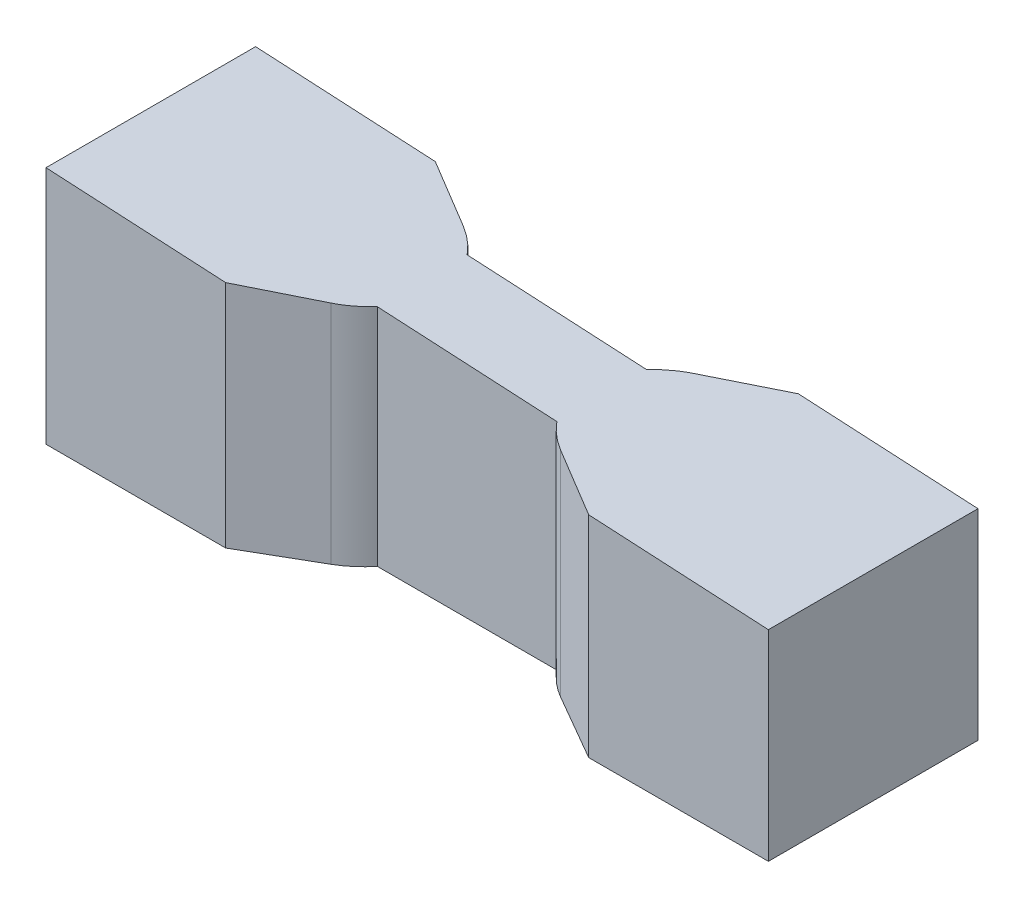
ISO-10303-21;
HEADER;
FILE_DESCRIPTION(('STEP AP214'),'2;1');
FILE_NAME('part.step','',(''),(''),'','','');
FILE_SCHEMA(('AUTOMOTIVE_DESIGN { 1 0 10303 214 1 1 1 1 }'));
ENDSEC;
DATA;
#1=APPLICATION_CONTEXT('core data for automotive mechanical design processes');
#2=APPLICATION_PROTOCOL_DEFINITION('international standard','automotive_design',2000,#1);
#3=PRODUCT_CONTEXT('',#1,'mechanical');
#4=PRODUCT('Part','Part','',(#3));
#5=PRODUCT_RELATED_PRODUCT_CATEGORY('part','',(#4));
#6=PRODUCT_DEFINITION_FORMATION('','',#4);
#7=PRODUCT_DEFINITION_CONTEXT('part definition',#1,'design');
#8=PRODUCT_DEFINITION('design','',#6,#7);
#9=PRODUCT_DEFINITION_SHAPE('','',#8);
#10=(LENGTH_UNIT() NAMED_UNIT(*) SI_UNIT(.MILLI.,.METRE.));
#11=(NAMED_UNIT(*) PLANE_ANGLE_UNIT() SI_UNIT($,.RADIAN.));
#12=(NAMED_UNIT(*) SI_UNIT($,.STERADIAN.) SOLID_ANGLE_UNIT());
#13=UNCERTAINTY_MEASURE_WITH_UNIT(LENGTH_MEASURE(1.E-05),#10,'distance_accuracy_value','');
#14=(GEOMETRIC_REPRESENTATION_CONTEXT(3) GLOBAL_UNCERTAINTY_ASSIGNED_CONTEXT((#13)) GLOBAL_UNIT_ASSIGNED_CONTEXT((#10,
#11,#12)) REPRESENTATION_CONTEXT('',''));
#15=CARTESIAN_POINT('',(0.,0.,0.));
#16=DIRECTION('',(0.,0.,1.));
#17=DIRECTION('',(1.,0.,0.));
#18=AXIS2_PLACEMENT_3D('',#15,#16,#17);
#19=CARTESIAN_POINT('',(-5.33441972255008,20.8867799866972,0.384272952353028));
#20=DIRECTION('',(0.,-1.,0.));
#21=DIRECTION('',(0.,0.,-1.));
#22=AXIS2_PLACEMENT_3D('',#19,#20,#21);
#23=CYLINDRICAL_SURFACE('',#22,3.);
#24=DIRECTION('',(0.,-1.,0.));
#25=VECTOR('',#24,1.);
#26=CARTESIAN_POINT('',(-3.83441972255009,8.,-2.21380325900029));
#27=LINE('',#26,#25);
#28=CARTESIAN_POINT('',(-3.83441972255009,7.5566270996423,-2.21380325900029));
#29=VERTEX_POINT('',#28);
#30=CARTESIAN_POINT('',(-3.83441972255009,0.,-2.21380325900029));
#31=VERTEX_POINT('',#30);
#32=EDGE_CURVE('E180',#29,#31,#27,.T.);
#33=ORIENTED_EDGE('',*,*,#32,.F.);
#34=CARTESIAN_POINT('',(-5.33441972255008,7.6374582740807,0.384272952353028));
#35=DIRECTION('',(-0.0538093788841997,-0.99855122589885,0.));
#36=DIRECTION('',(0.99855122589885,-0.0538093788841997,0.));
#37=AXIS2_PLACEMENT_3D('',#34,#35,#36);
#38=ELLIPSE('',#37,3.00435262827857,3.);
#39=CARTESIAN_POINT('',(-3.,7.51166234887679,-1.5));
#40=VERTEX_POINT('',#39);
#41=EDGE_CURVE('E453',#29,#40,#38,.T.);
#42=ORIENTED_EDGE('',*,*,#41,.T.);
#43=DIRECTION('',(0.,-1.,0.));
#44=VECTOR('',#43,1.);
#45=CARTESIAN_POINT('',(-3.,20.8867799866972,-1.5));
#46=LINE('',#45,#44);
#47=CARTESIAN_POINT('',(-3.,0.,-1.5));
#48=VERTEX_POINT('',#47);
#49=EDGE_CURVE('E193',#40,#48,#46,.T.);
#50=ORIENTED_EDGE('',*,*,#49,.T.);
#51=CARTESIAN_POINT('',(-5.33441972255008,0.,0.384272952353028));
#52=DIRECTION('',(0.,1.,0.));
#53=DIRECTION('',(0.,0.,1.));
#54=AXIS2_PLACEMENT_3D('',#51,#52,#53);
#55=CIRCLE('',#54,3.);
#56=EDGE_CURVE('E182',#48,#31,#55,.T.);
#57=ORIENTED_EDGE('',*,*,#56,.T.);
#58=EDGE_LOOP('',(#33,#42,#50,#57));
#59=FACE_BOUND('',#58,.T.);
#60=ADVANCED_FACE('F36',(#59),#23,.T.);
#61=CARTESIAN_POINT('',(6.06217782649111,8.,-3.5));
#62=DIRECTION('',(0.,0.,1.));
#63=DIRECTION('',(1.,0.,0.));
#64=AXIS2_PLACEMENT_3D('',#61,#62,#63);
#65=PLANE('',#64);
#66=DIRECTION('',(0.,-1.,0.));
#67=VECTOR('',#66,1.);
#68=CARTESIAN_POINT('',(6.06217782649111,8.,-3.5));
#69=LINE('',#68,#67);
#70=CARTESIAN_POINT('',(6.06217782649111,7.02332469775357,-3.5));
#71=VERTEX_POINT('',#70);
#72=CARTESIAN_POINT('',(6.06217782649111,0.,-3.5));
#73=VERTEX_POINT('',#72);
#74=EDGE_CURVE('E44',#71,#73,#69,.T.);
#75=ORIENTED_EDGE('',*,*,#74,.F.);
#76=DIRECTION('',(0.99855122589885,-0.0538093788841997,0.));
#77=VECTOR('',#76,1.);
#78=CARTESIAN_POINT('',(12.0621778264911,6.7,-3.5));
#79=LINE('',#78,#77);
#80=CARTESIAN_POINT('',(12.0621778264911,6.7,-3.5));
#81=VERTEX_POINT('',#80);
#82=EDGE_CURVE('E166',#71,#81,#79,.T.);
#83=ORIENTED_EDGE('',*,*,#82,.T.);
#84=DIRECTION('',(0.,-1.,0.));
#85=VECTOR('',#84,1.);
#86=CARTESIAN_POINT('',(12.0621778264911,8.,-3.5));
#87=LINE('',#86,#85);
#88=CARTESIAN_POINT('',(12.0621778264911,0.,-3.5));
#89=VERTEX_POINT('',#88);
#90=EDGE_CURVE('E218',#81,#89,#87,.T.);
#91=ORIENTED_EDGE('',*,*,#90,.T.);
#92=DIRECTION('',(-1.,0.,0.));
#93=VECTOR('',#92,1.);
#94=CARTESIAN_POINT('',(6.06217782649111,0.,-3.5));
#95=LINE('',#94,#93);
#96=EDGE_CURVE('E197',#89,#73,#95,.T.);
#97=ORIENTED_EDGE('',*,*,#96,.T.);
#98=EDGE_LOOP('',(#75,#83,#91,#97));
#99=FACE_BOUND('',#98,.T.);
#100=ADVANCED_FACE('F38',(#99),#65,.F.);
#101=CARTESIAN_POINT('',(3.83441972255009,8.,-2.21380325900029));
#102=DIRECTION('',(0.499999999999998,0.,0.86602540378444));
#103=DIRECTION('',(0.86602540378444,0.,-0.499999999999998));
#104=AXIS2_PLACEMENT_3D('',#101,#102,#103);
#105=PLANE('',#104);
#106=DIRECTION('',(0.,-1.,0.));
#107=VECTOR('',#106,1.);
#108=CARTESIAN_POINT('',(3.83441972255009,8.,-2.21380325900029));
#109=LINE('',#108,#107);
#110=CARTESIAN_POINT('',(3.83441972255009,7.1433729003577,-2.21380325900029));
#111=VERTEX_POINT('',#110);
#112=CARTESIAN_POINT('',(3.83441972255009,0.,-2.21380325900029));
#113=VERTEX_POINT('',#112);
#114=EDGE_CURVE('E230',#111,#113,#109,.T.);
#115=ORIENTED_EDGE('',*,*,#114,.F.);
#116=DIRECTION('',(0.865083886101273,-0.0466171643341957,-0.499456414512175));
#117=VECTOR('',#116,1.);
#118=CARTESIAN_POINT('',(3.79987387245253,7.1452344881146,-2.19385820314708));
#119=LINE('',#118,#117);
#120=EDGE_CURVE('E238',#111,#71,#119,.T.);
#121=ORIENTED_EDGE('',*,*,#120,.T.);
#122=ORIENTED_EDGE('',*,*,#74,.T.);
#123=DIRECTION('',(-0.86602540378444,0.,0.499999999999998));
#124=VECTOR('',#123,1.);
#125=CARTESIAN_POINT('',(3.83441972255009,0.,-2.21380325900029));
#126=LINE('',#125,#124);
#127=EDGE_CURVE('E200',#73,#113,#126,.T.);
#128=ORIENTED_EDGE('',*,*,#127,.T.);
#129=EDGE_LOOP('',(#115,#121,#122,#128));
#130=FACE_BOUND('',#129,.T.);
#131=ADVANCED_FACE('F236',(#130),#105,.F.);
#132=CARTESIAN_POINT('',(5.33441972255008,8.,0.384272952353028));
#133=DIRECTION('',(0.,-1.,0.));
#134=DIRECTION('',(0.,0.,-1.));
#135=AXIS2_PLACEMENT_3D('',#132,#133,#134);
#136=CYLINDRICAL_SURFACE('',#135,3.);
#137=DIRECTION('',(0.,-1.,0.));
#138=VECTOR('',#137,1.);
#139=CARTESIAN_POINT('',(3.,8.,-1.5));
#140=LINE('',#139,#138);
#141=CARTESIAN_POINT('',(3.,7.18833765112322,-1.5));
#142=VERTEX_POINT('',#141);
#143=CARTESIAN_POINT('',(3.,0.,-1.5));
#144=VERTEX_POINT('',#143);
#145=EDGE_CURVE('E228',#142,#144,#140,.T.);
#146=ORIENTED_EDGE('',*,*,#145,.F.);
#147=CARTESIAN_POINT('',(5.33441972255008,7.06254172591931,0.384272952353028));
#148=DIRECTION('',(-0.0538093788841997,-0.99855122589885,0.));
#149=DIRECTION('',(0.99855122589885,-0.0538093788841997,0.));
#150=AXIS2_PLACEMENT_3D('',#147,#148,#149);
#151=ELLIPSE('',#150,3.00435262827857,3.);
#152=EDGE_CURVE('E447',#142,#111,#151,.T.);
#153=ORIENTED_EDGE('',*,*,#152,.T.);
#154=ORIENTED_EDGE('',*,*,#114,.T.);
#155=CARTESIAN_POINT('',(5.33441972255008,0.,0.384272952353028));
#156=DIRECTION('',(0.,1.,0.));
#157=DIRECTION('',(0.,0.,1.));
#158=AXIS2_PLACEMENT_3D('',#155,#156,#157);
#159=CIRCLE('',#158,3.);
#160=EDGE_CURVE('E203',#113,#144,#159,.T.);
#161=ORIENTED_EDGE('',*,*,#160,.T.);
#162=EDGE_LOOP('',(#146,#153,#154,#161));
#163=FACE_BOUND('',#162,.T.);
#164=ADVANCED_FACE('F306',(#163),#136,.T.);
#165=CARTESIAN_POINT('',(5.33441972255008,8.,-0.38427295235303));
#166=DIRECTION('',(0.,-1.,0.));
#167=DIRECTION('',(0.,0.,-1.));
#168=AXIS2_PLACEMENT_3D('',#165,#166,#167);
#169=CYLINDRICAL_SURFACE('',#168,3.);
#170=DIRECTION('',(0.,-1.,0.));
#171=VECTOR('',#170,1.);
#172=CARTESIAN_POINT('',(3.83441972255009,8.,2.21380325900029));
#173=LINE('',#172,#171);
#174=CARTESIAN_POINT('',(3.83441972255009,7.1433729003577,2.21380325900029));
#175=VERTEX_POINT('',#174);
#176=CARTESIAN_POINT('',(3.83441972255009,0.,2.21380325900029));
#177=VERTEX_POINT('',#176);
#178=EDGE_CURVE('E224',#175,#177,#173,.T.);
#179=ORIENTED_EDGE('',*,*,#178,.F.);
#180=CARTESIAN_POINT('',(5.33441972255008,7.06254172591931,-0.38427295235303));
#181=DIRECTION('',(-0.0538093788841997,-0.99855122589885,0.));
#182=DIRECTION('',(0.99855122589885,-0.0538093788841997,0.));
#183=AXIS2_PLACEMENT_3D('',#180,#181,#182);
#184=ELLIPSE('',#183,3.00435262827857,3.);
#185=CARTESIAN_POINT('',(3.,7.18833765112322,1.5));
#186=VERTEX_POINT('',#185);
#187=EDGE_CURVE('E460',#175,#186,#184,.T.);
#188=ORIENTED_EDGE('',*,*,#187,.T.);
#189=DIRECTION('',(0.,-1.,0.));
#190=VECTOR('',#189,1.);
#191=CARTESIAN_POINT('',(3.,8.,1.5));
#192=LINE('',#191,#190);
#193=CARTESIAN_POINT('',(3.,0.,1.5));
#194=VERTEX_POINT('',#193);
#195=EDGE_CURVE('E226',#186,#194,#192,.T.);
#196=ORIENTED_EDGE('',*,*,#195,.T.);
#197=CARTESIAN_POINT('',(5.33441972255008,0.,-0.38427295235303));
#198=DIRECTION('',(0.,1.,0.));
#199=DIRECTION('',(0.,0.,-1.));
#200=AXIS2_PLACEMENT_3D('',#197,#198,#199);
#201=CIRCLE('',#200,3.);
#202=EDGE_CURVE('E206',#194,#177,#201,.T.);
#203=ORIENTED_EDGE('',*,*,#202,.T.);
#204=EDGE_LOOP('',(#179,#188,#196,#203));
#205=FACE_BOUND('',#204,.T.);
#206=ADVANCED_FACE('F265',(#205),#169,.T.);
#207=CARTESIAN_POINT('',(3.83441972255009,8.,2.21380325900029));
#208=DIRECTION('',(0.499999999999998,0.,-0.86602540378444));
#209=DIRECTION('',(-0.86602540378444,0.,-0.499999999999998));
#210=AXIS2_PLACEMENT_3D('',#207,#208,#209);
#211=PLANE('',#210);
#212=DIRECTION('',(0.,-1.,0.));
#213=VECTOR('',#212,1.);
#214=CARTESIAN_POINT('',(6.06217782649111,8.,3.5));
#215=LINE('',#214,#213);
#216=CARTESIAN_POINT('',(6.06217782649111,7.02332469775357,3.5));
#217=VERTEX_POINT('',#216);
#218=CARTESIAN_POINT('',(6.06217782649111,0.,3.5));
#219=VERTEX_POINT('',#218);
#220=EDGE_CURVE('E222',#217,#219,#215,.T.);
#221=ORIENTED_EDGE('',*,*,#220,.F.);
#222=DIRECTION('',(-0.865083886101274,0.0466171643341958,-0.499456414512175));
#223=VECTOR('',#222,1.);
#224=CARTESIAN_POINT('',(3.79987387245252,7.1452344881146,2.19385820314708));
#225=LINE('',#224,#223);
#226=EDGE_CURVE('E262',#217,#175,#225,.T.);
#227=ORIENTED_EDGE('',*,*,#226,.T.);
#228=ORIENTED_EDGE('',*,*,#178,.T.);
#229=DIRECTION('',(0.86602540378444,0.,0.499999999999998));
#230=VECTOR('',#229,1.);
#231=CARTESIAN_POINT('',(3.83441972255009,0.,2.21380325900029));
#232=LINE('',#231,#230);
#233=EDGE_CURVE('E209',#177,#219,#232,.T.);
#234=ORIENTED_EDGE('',*,*,#233,.T.);
#235=EDGE_LOOP('',(#221,#227,#228,#234));
#236=FACE_BOUND('',#235,.T.);
#237=ADVANCED_FACE('F260',(#236),#211,.F.);
#238=CARTESIAN_POINT('',(6.06217782649111,8.,3.5));
#239=DIRECTION('',(0.,0.,-1.));
#240=DIRECTION('',(-1.,0.,0.));
#241=AXIS2_PLACEMENT_3D('',#238,#239,#240);
#242=PLANE('',#241);
#243=DIRECTION('',(0.,-1.,0.));
#244=VECTOR('',#243,1.);
#245=CARTESIAN_POINT('',(12.0621778264911,8.,3.5));
#246=LINE('',#245,#244);
#247=CARTESIAN_POINT('',(12.0621778264911,6.7,3.5));
#248=VERTEX_POINT('',#247);
#249=CARTESIAN_POINT('',(12.0621778264911,0.,3.5));
#250=VERTEX_POINT('',#249);
#251=EDGE_CURVE('E220',#248,#250,#246,.T.);
#252=ORIENTED_EDGE('',*,*,#251,.F.);
#253=DIRECTION('',(0.99855122589885,-0.0538093788841997,0.));
#254=VECTOR('',#253,1.);
#255=CARTESIAN_POINT('',(12.0621778264911,6.7,3.5));
#256=LINE('',#255,#254);
#257=EDGE_CURVE('E167',#217,#248,#256,.T.);
#258=ORIENTED_EDGE('',*,*,#257,.F.);
#259=ORIENTED_EDGE('',*,*,#220,.T.);
#260=DIRECTION('',(1.,0.,0.));
#261=VECTOR('',#260,1.);
#262=CARTESIAN_POINT('',(6.06217782649111,0.,3.5));
#263=LINE('',#262,#261);
#264=EDGE_CURVE('E212',#219,#250,#263,.T.);
#265=ORIENTED_EDGE('',*,*,#264,.T.);
#266=EDGE_LOOP('',(#252,#258,#259,#265));
#267=FACE_BOUND('',#266,.T.);
#268=ADVANCED_FACE('F255',(#267),#242,.F.);
#269=CARTESIAN_POINT('',(12.0621778264911,8.,-3.5));
#270=DIRECTION('',(-1.,0.,0.));
#271=DIRECTION('',(0.,0.,1.));
#272=AXIS2_PLACEMENT_3D('',#269,#270,#271);
#273=PLANE('',#272);
#274=ORIENTED_EDGE('',*,*,#90,.F.);
#275=DIRECTION('',(0.,0.,1.));
#276=VECTOR('',#275,1.);
#277=CARTESIAN_POINT('',(12.0621778264911,6.7,-3.5));
#278=LINE('',#277,#276);
#279=EDGE_CURVE('E465',#81,#248,#278,.T.);
#280=ORIENTED_EDGE('',*,*,#279,.T.);
#281=ORIENTED_EDGE('',*,*,#251,.T.);
#282=DIRECTION('',(0.,0.,-1.));
#283=VECTOR('',#282,1.);
#284=CARTESIAN_POINT('',(12.0621778264911,0.,-3.5));
#285=LINE('',#284,#283);
#286=EDGE_CURVE('E215',#250,#89,#285,.T.);
#287=ORIENTED_EDGE('',*,*,#286,.T.);
#288=EDGE_LOOP('',(#274,#280,#281,#287));
#289=FACE_BOUND('',#288,.T.);
#290=ADVANCED_FACE('F249',(#289),#273,.F.);
#291=CARTESIAN_POINT('',(5.33441972255008,0.,-0.38427295235303));
#292=DIRECTION('',(0.,-1.,0.));
#293=DIRECTION('',(0.,0.,-1.));
#294=AXIS2_PLACEMENT_3D('',#291,#292,#293);
#295=PLANE('',#294);
#296=CARTESIAN_POINT('',(-5.33441972255008,0.,-0.38427295235303));
#297=DIRECTION('',(0.,1.,0.));
#298=DIRECTION('',(0.,0.,-1.));
#299=AXIS2_PLACEMENT_3D('',#296,#297,#298);
#300=CIRCLE('',#299,3.);
#301=CARTESIAN_POINT('',(-3.83441972255009,0.,2.21380325900029));
#302=VERTEX_POINT('',#301);
#303=CARTESIAN_POINT('',(-3.,0.,1.5));
#304=VERTEX_POINT('',#303);
#305=EDGE_CURVE('E185',#302,#304,#300,.T.);
#306=ORIENTED_EDGE('',*,*,#305,.F.);
#307=DIRECTION('',(0.86602540378444,0.,-0.499999999999998));
#308=VECTOR('',#307,1.);
#309=CARTESIAN_POINT('',(-3.83441972255009,0.,2.21380325900029));
#310=LINE('',#309,#308);
#311=CARTESIAN_POINT('',(-6.06217782649111,0.,3.5));
#312=VERTEX_POINT('',#311);
#313=EDGE_CURVE('E156',#312,#302,#310,.T.);
#314=ORIENTED_EDGE('',*,*,#313,.F.);
#315=DIRECTION('',(1.,0.,0.));
#316=VECTOR('',#315,1.);
#317=CARTESIAN_POINT('',(-6.06217782649111,0.,3.5));
#318=LINE('',#317,#316);
#319=CARTESIAN_POINT('',(-12.0621778264911,0.,3.5));
#320=VERTEX_POINT('',#319);
#321=EDGE_CURVE('E438',#320,#312,#318,.T.);
#322=ORIENTED_EDGE('',*,*,#321,.F.);
#323=DIRECTION('',(0.,0.,1.));
#324=VECTOR('',#323,1.);
#325=CARTESIAN_POINT('',(-12.0621778264911,0.,-3.5));
#326=LINE('',#325,#324);
#327=CARTESIAN_POINT('',(-12.0621778264911,0.,-3.5));
#328=VERTEX_POINT('',#327);
#329=EDGE_CURVE('E171',#328,#320,#326,.T.);
#330=ORIENTED_EDGE('',*,*,#329,.F.);
#331=DIRECTION('',(-1.,0.,0.));
#332=VECTOR('',#331,1.);
#333=CARTESIAN_POINT('',(-6.06217782649111,0.,-3.5));
#334=LINE('',#333,#332);
#335=CARTESIAN_POINT('',(-6.06217782649111,0.,-3.5));
#336=VERTEX_POINT('',#335);
#337=EDGE_CURVE('E441',#336,#328,#334,.T.);
#338=ORIENTED_EDGE('',*,*,#337,.F.);
#339=DIRECTION('',(-0.86602540378444,0.,-0.499999999999998));
#340=VECTOR('',#339,1.);
#341=CARTESIAN_POINT('',(-3.83441972255009,0.,-2.21380325900029));
#342=LINE('',#341,#340);
#343=EDGE_CURVE('E443',#31,#336,#342,.T.);
#344=ORIENTED_EDGE('',*,*,#343,.F.);
#345=ORIENTED_EDGE('',*,*,#56,.F.);
#346=DIRECTION('',(-1.,0.,0.));
#347=VECTOR('',#346,1.);
#348=CARTESIAN_POINT('',(3.,0.,-1.5));
#349=LINE('',#348,#347);
#350=EDGE_CURVE('E190',#144,#48,#349,.T.);
#351=ORIENTED_EDGE('',*,*,#350,.F.);
#352=ORIENTED_EDGE('',*,*,#160,.F.);
#353=ORIENTED_EDGE('',*,*,#127,.F.);
#354=ORIENTED_EDGE('',*,*,#96,.F.);
#355=ORIENTED_EDGE('',*,*,#286,.F.);
#356=ORIENTED_EDGE('',*,*,#264,.F.);
#357=ORIENTED_EDGE('',*,*,#233,.F.);
#358=ORIENTED_EDGE('',*,*,#202,.F.);
#359=DIRECTION('',(1.,0.,0.));
#360=VECTOR('',#359,1.);
#361=CARTESIAN_POINT('',(3.,0.,1.5));
#362=LINE('',#361,#360);
#363=EDGE_CURVE('E187',#304,#194,#362,.T.);
#364=ORIENTED_EDGE('',*,*,#363,.F.);
#365=EDGE_LOOP('',(#306,#314,#322,#330,#338,#344,#345,#351,#352,#353,#354,#355,#356,#357,#358,#364));
#366=FACE_BOUND('',#365,.T.);
#367=ADVANCED_FACE('F243',(#366),#295,.T.);
#368=CARTESIAN_POINT('',(3.,20.8867799866972,-1.5));
#369=DIRECTION('',(0.,0.,1.));
#370=DIRECTION('',(1.,0.,0.));
#371=AXIS2_PLACEMENT_3D('',#368,#369,#370);
#372=PLANE('',#371);
#373=ORIENTED_EDGE('',*,*,#49,.F.);
#374=DIRECTION('',(0.99855122589885,-0.0538093788841997,0.));
#375=VECTOR('',#374,1.);
#376=CARTESIAN_POINT('',(2.26396322440291,7.22800079579079,-1.5));
#377=LINE('',#376,#375);
#378=EDGE_CURVE('E450',#40,#142,#377,.T.);
#379=ORIENTED_EDGE('',*,*,#378,.T.);
#380=ORIENTED_EDGE('',*,*,#145,.T.);
#381=ORIENTED_EDGE('',*,*,#350,.T.);
#382=EDGE_LOOP('',(#373,#379,#380,#381));
#383=FACE_BOUND('',#382,.T.);
#384=ADVANCED_FACE('F286',(#383),#372,.F.);
#385=CARTESIAN_POINT('',(3.,20.8867799866972,1.5));
#386=DIRECTION('',(0.,0.,-1.));
#387=DIRECTION('',(-1.,0.,0.));
#388=AXIS2_PLACEMENT_3D('',#385,#386,#387);
#389=PLANE('',#388);
#390=ORIENTED_EDGE('',*,*,#195,.F.);
#391=DIRECTION('',(-0.99855122589885,0.0538093788841997,0.));
#392=VECTOR('',#391,1.);
#393=CARTESIAN_POINT('',(2.26396322440291,7.22800079579079,1.5));
#394=LINE('',#393,#392);
#395=CARTESIAN_POINT('',(-3.,7.51166234887679,1.5));
#396=VERTEX_POINT('',#395);
#397=EDGE_CURVE('E274',#186,#396,#394,.T.);
#398=ORIENTED_EDGE('',*,*,#397,.T.);
#399=DIRECTION('',(0.,-1.,0.));
#400=VECTOR('',#399,1.);
#401=CARTESIAN_POINT('',(-3.,20.8867799866972,1.5));
#402=LINE('',#401,#400);
#403=EDGE_CURVE('E195',#396,#304,#402,.T.);
#404=ORIENTED_EDGE('',*,*,#403,.T.);
#405=ORIENTED_EDGE('',*,*,#363,.T.);
#406=EDGE_LOOP('',(#390,#398,#404,#405));
#407=FACE_BOUND('',#406,.T.);
#408=ADVANCED_FACE('F271',(#407),#389,.F.);
#409=CARTESIAN_POINT('',(-5.33441972255008,20.8867799866972,-0.38427295235303));
#410=DIRECTION('',(0.,-1.,0.));
#411=DIRECTION('',(0.,0.,-1.));
#412=AXIS2_PLACEMENT_3D('',#409,#410,#411);
#413=CYLINDRICAL_SURFACE('',#412,3.);
#414=ORIENTED_EDGE('',*,*,#403,.F.);
#415=CARTESIAN_POINT('',(-5.33441972255008,7.6374582740807,-0.38427295235303));
#416=DIRECTION('',(-0.0538093788841997,-0.99855122589885,0.));
#417=DIRECTION('',(0.99855122589885,-0.0538093788841997,0.));
#418=AXIS2_PLACEMENT_3D('',#415,#416,#417);
#419=ELLIPSE('',#418,3.00435262827857,3.);
#420=CARTESIAN_POINT('',(-3.83441972255009,7.5566270996423,2.21380325900029));
#421=VERTEX_POINT('',#420);
#422=EDGE_CURVE('E463',#396,#421,#419,.T.);
#423=ORIENTED_EDGE('',*,*,#422,.T.);
#424=DIRECTION('',(0.,-1.,0.));
#425=VECTOR('',#424,1.);
#426=CARTESIAN_POINT('',(-3.83441972255009,8.,2.21380325900029));
#427=LINE('',#426,#425);
#428=EDGE_CURVE('E58',#421,#302,#427,.T.);
#429=ORIENTED_EDGE('',*,*,#428,.T.);
#430=ORIENTED_EDGE('',*,*,#305,.T.);
#431=EDGE_LOOP('',(#414,#423,#429,#430));
#432=FACE_BOUND('',#431,.T.);
#433=ADVANCED_FACE('F275',(#432),#413,.T.);
#434=CARTESIAN_POINT('',(-3.83441972255009,8.,-2.21380325900029));
#435=DIRECTION('',(-0.499999999999998,0.,0.86602540378444));
#436=DIRECTION('',(0.86602540378444,0.,0.499999999999998));
#437=AXIS2_PLACEMENT_3D('',#434,#435,#436);
#438=PLANE('',#437);
#439=DIRECTION('',(0.,-1.,0.));
#440=VECTOR('',#439,1.);
#441=CARTESIAN_POINT('',(-6.06217782649111,8.,-3.5));
#442=LINE('',#441,#440);
#443=CARTESIAN_POINT('',(-6.0621778264911,7.67667530224643,-3.5));
#444=VERTEX_POINT('',#443);
#445=EDGE_CURVE('E174',#444,#336,#442,.T.);
#446=ORIENTED_EDGE('',*,*,#445,.F.);
#447=DIRECTION('',(0.865083886101274,-0.0466171643341957,0.499456414512175));
#448=VECTOR('',#447,1.);
#449=CARTESIAN_POINT('',(-3.85229995743815,7.55759061989913,-2.22412641742608));
#450=LINE('',#449,#448);
#451=EDGE_CURVE('E456',#444,#29,#450,.T.);
#452=ORIENTED_EDGE('',*,*,#451,.T.);
#453=ORIENTED_EDGE('',*,*,#32,.T.);
#454=ORIENTED_EDGE('',*,*,#343,.T.);
#455=EDGE_LOOP('',(#446,#452,#453,#454));
#456=FACE_BOUND('',#455,.T.);
#457=ADVANCED_FACE('F277',(#456),#438,.F.);
#458=CARTESIAN_POINT('',(-6.06217782649111,8.,-3.5));
#459=DIRECTION('',(0.,0.,1.));
#460=DIRECTION('',(1.,0.,0.));
#461=AXIS2_PLACEMENT_3D('',#458,#459,#460);
#462=PLANE('',#461);
#463=DIRECTION('',(0.,-1.,0.));
#464=VECTOR('',#463,1.);
#465=CARTESIAN_POINT('',(-12.0621778264911,8.,-3.5));
#466=LINE('',#465,#464);
#467=CARTESIAN_POINT('',(-12.0621778264911,8.,-3.5));
#468=VERTEX_POINT('',#467);
#469=EDGE_CURVE('E172',#468,#328,#466,.T.);
#470=ORIENTED_EDGE('',*,*,#469,.F.);
#471=EDGE_CURVE('E151',#468,#444,#79,.T.);
#472=ORIENTED_EDGE('',*,*,#471,.T.);
#473=ORIENTED_EDGE('',*,*,#445,.T.);
#474=ORIENTED_EDGE('',*,*,#337,.T.);
#475=EDGE_LOOP('',(#470,#472,#473,#474));
#476=FACE_BOUND('',#475,.T.);
#477=ADVANCED_FACE('F283',(#476),#462,.F.);
#478=CARTESIAN_POINT('',(-12.0621778264911,8.,-3.5));
#479=DIRECTION('',(1.,0.,0.));
#480=DIRECTION('',(0.,0.,-1.));
#481=AXIS2_PLACEMENT_3D('',#478,#479,#480);
#482=PLANE('',#481);
#483=ORIENTED_EDGE('',*,*,#329,.T.);
#484=DIRECTION('',(0.,-1.,0.));
#485=VECTOR('',#484,1.);
#486=CARTESIAN_POINT('',(-12.0621778264911,8.,3.5));
#487=LINE('',#486,#485);
#488=CARTESIAN_POINT('',(-12.0621778264911,8.,3.5));
#489=VERTEX_POINT('',#488);
#490=EDGE_CURVE('E163',#489,#320,#487,.T.);
#491=ORIENTED_EDGE('',*,*,#490,.F.);
#492=DIRECTION('',(0.,0.,1.));
#493=VECTOR('',#492,1.);
#494=CARTESIAN_POINT('',(-12.0621778264911,8.,-3.5));
#495=LINE('',#494,#493);
#496=EDGE_CURVE('E148',#468,#489,#495,.T.);
#497=ORIENTED_EDGE('',*,*,#496,.F.);
#498=ORIENTED_EDGE('',*,*,#469,.T.);
#499=EDGE_LOOP('',(#483,#491,#497,#498));
#500=FACE_BOUND('',#499,.T.);
#501=ADVANCED_FACE('F169',(#500),#482,.F.);
#502=CARTESIAN_POINT('',(-6.06217782649111,8.,3.5));
#503=DIRECTION('',(0.,0.,-1.));
#504=DIRECTION('',(-1.,0.,0.));
#505=AXIS2_PLACEMENT_3D('',#502,#503,#504);
#506=PLANE('',#505);
#507=DIRECTION('',(0.,-1.,0.));
#508=VECTOR('',#507,1.);
#509=CARTESIAN_POINT('',(-6.06217782649111,8.,3.5));
#510=LINE('',#509,#508);
#511=CARTESIAN_POINT('',(-6.06217782649111,7.67667530224643,3.5));
#512=VERTEX_POINT('',#511);
#513=EDGE_CURVE('E165',#512,#312,#510,.T.);
#514=ORIENTED_EDGE('',*,*,#513,.F.);
#515=EDGE_CURVE('E51',#489,#512,#256,.T.);
#516=ORIENTED_EDGE('',*,*,#515,.F.);
#517=ORIENTED_EDGE('',*,*,#490,.T.);
#518=ORIENTED_EDGE('',*,*,#321,.T.);
#519=EDGE_LOOP('',(#514,#516,#517,#518));
#520=FACE_BOUND('',#519,.T.);
#521=ADVANCED_FACE('F161',(#520),#506,.F.);
#522=CARTESIAN_POINT('',(-3.83441972255009,8.,2.21380325900029));
#523=DIRECTION('',(-0.499999999999998,0.,-0.86602540378444));
#524=DIRECTION('',(-0.86602540378444,0.,0.499999999999998));
#525=AXIS2_PLACEMENT_3D('',#522,#523,#524);
#526=PLANE('',#525);
#527=ORIENTED_EDGE('',*,*,#428,.F.);
#528=DIRECTION('',(-0.865083886101274,0.0466171643341957,0.499456414512175));
#529=VECTOR('',#528,1.);
#530=CARTESIAN_POINT('',(-3.85229995743814,7.55759061989913,2.22412641742608));
#531=LINE('',#530,#529);
#532=EDGE_CURVE('E11',#421,#512,#531,.T.);
#533=ORIENTED_EDGE('',*,*,#532,.T.);
#534=ORIENTED_EDGE('',*,*,#513,.T.);
#535=ORIENTED_EDGE('',*,*,#313,.T.);
#536=EDGE_LOOP('',(#527,#533,#534,#535));
#537=FACE_BOUND('',#536,.T.);
#538=ADVANCED_FACE('F387',(#537),#526,.F.);
#539=CARTESIAN_POINT('',(12.0621778264911,6.7,-3.5));
#540=DIRECTION('',(-0.0538093788841997,-0.99855122589885,0.));
#541=DIRECTION('',(0.99855122589885,-0.0538093788841997,0.));
#542=AXIS2_PLACEMENT_3D('',#539,#540,#541);
#543=PLANE('',#542);
#544=ORIENTED_EDGE('',*,*,#152,.F.);
#545=ORIENTED_EDGE('',*,*,#378,.F.);
#546=ORIENTED_EDGE('',*,*,#41,.F.);
#547=ORIENTED_EDGE('',*,*,#451,.F.);
#548=ORIENTED_EDGE('',*,*,#471,.F.);
#549=ORIENTED_EDGE('',*,*,#496,.T.);
#550=ORIENTED_EDGE('',*,*,#515,.T.);
#551=ORIENTED_EDGE('',*,*,#532,.F.);
#552=ORIENTED_EDGE('',*,*,#422,.F.);
#553=ORIENTED_EDGE('',*,*,#397,.F.);
#554=ORIENTED_EDGE('',*,*,#187,.F.);
#555=ORIENTED_EDGE('',*,*,#226,.F.);
#556=ORIENTED_EDGE('',*,*,#257,.T.);
#557=ORIENTED_EDGE('',*,*,#279,.F.);
#558=ORIENTED_EDGE('',*,*,#82,.F.);
#559=ORIENTED_EDGE('',*,*,#120,.F.);
#560=EDGE_LOOP('',(#544,#545,#546,#547,#548,#549,#550,#551,#552,#553,#554,#555,#556,#557,#558,#559));
#561=FACE_BOUND('',#560,.T.);
#562=ADVANCED_FACE('F149',(#561),#543,.F.);
#563=CLOSED_SHELL('',(#60,#100,#131,#164,#206,#237,#268,#290,#367,#384,#408,#433,#457,#477,#501,
#521,#538,#562));
#564=MANIFOLD_SOLID_BREP('B2',#563);
#565=ADVANCED_BREP_SHAPE_REPRESENTATION('',(#18,#564),#14);
#566=SHAPE_DEFINITION_REPRESENTATION(#9,#565);
ENDSEC;
END-ISO-10303-21;
